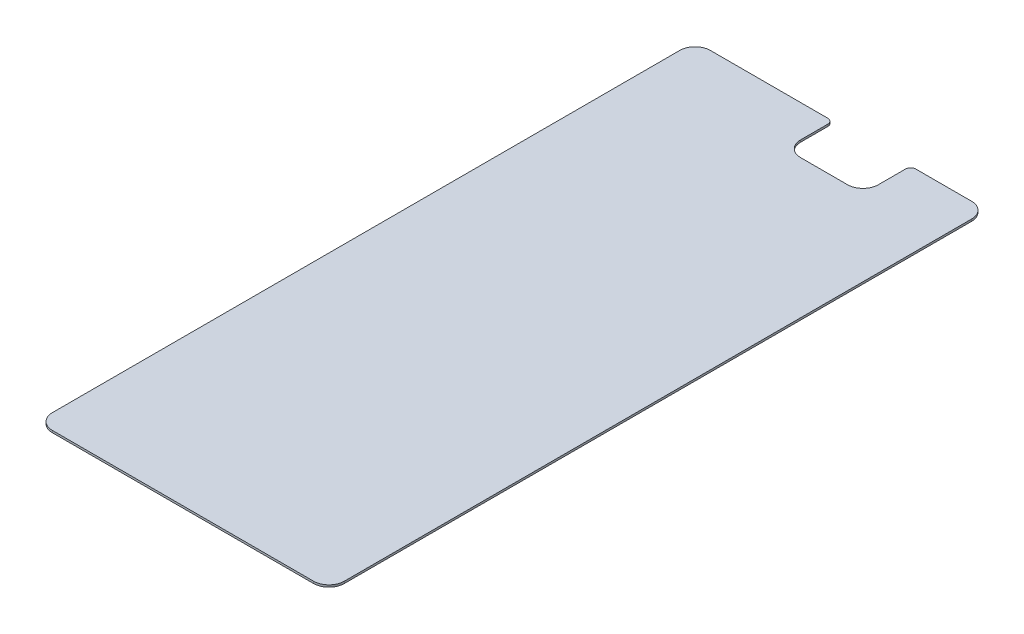
ISO-10303-21;
HEADER;
FILE_DESCRIPTION(('STEP AP214'),'2;1');
FILE_NAME('part.step','',(''),(''),'','','');
FILE_SCHEMA(('AUTOMOTIVE_DESIGN { 1 0 10303 214 1 1 1 1 }'));
ENDSEC;
DATA;
#1=APPLICATION_CONTEXT('core data for automotive mechanical design processes');
#2=APPLICATION_PROTOCOL_DEFINITION('international standard','automotive_design',2000,#1);
#3=PRODUCT_CONTEXT('',#1,'mechanical');
#4=PRODUCT('Part','Part','',(#3));
#5=PRODUCT_RELATED_PRODUCT_CATEGORY('part','',(#4));
#6=PRODUCT_DEFINITION_FORMATION('','',#4);
#7=PRODUCT_DEFINITION_CONTEXT('part definition',#1,'design');
#8=PRODUCT_DEFINITION('design','',#6,#7);
#9=PRODUCT_DEFINITION_SHAPE('','',#8);
#10=(LENGTH_UNIT() NAMED_UNIT(*) SI_UNIT(.MILLI.,.METRE.));
#11=(NAMED_UNIT(*) PLANE_ANGLE_UNIT() SI_UNIT($,.RADIAN.));
#12=(NAMED_UNIT(*) SI_UNIT($,.STERADIAN.) SOLID_ANGLE_UNIT());
#13=UNCERTAINTY_MEASURE_WITH_UNIT(LENGTH_MEASURE(1.E-05),#10,'distance_accuracy_value','');
#14=(GEOMETRIC_REPRESENTATION_CONTEXT(3) GLOBAL_UNCERTAINTY_ASSIGNED_CONTEXT((#13)) GLOBAL_UNIT_ASSIGNED_CONTEXT((#10,
#11,#12)) REPRESENTATION_CONTEXT('',''));
#15=CARTESIAN_POINT('',(0.,0.,0.));
#16=DIRECTION('',(0.,0.,1.));
#17=DIRECTION('',(1.,0.,0.));
#18=AXIS2_PLACEMENT_3D('',#15,#16,#17);
#19=CARTESIAN_POINT('',(12.7357421171239,29.2000004392877,-39.7483789044071));
#20=CARTESIAN_POINT('',(12.8347081232814,29.2000004392877,-39.7483789042746));
#21=CARTESIAN_POINT('',(12.9320248360273,29.2000004392877,-39.7386882795925));
#22=CARTESIAN_POINT('',(13.123491519264,29.2000004392877,-39.7007004499652));
#23=CARTESIAN_POINT('',(13.2186313452943,29.2000004392877,-39.6719438307547));
#24=CARTESIAN_POINT('',(13.4000890739177,29.2000004392877,-39.5968364621105));
#25=CARTESIAN_POINT('',(13.4861543632835,29.2000004392877,-39.5508677837086));
#26=CARTESIAN_POINT('',(13.649039179167,29.2000004392877,-39.4422472942158));
#27=CARTESIAN_POINT('',(13.7261743302098,29.2000004392877,-39.3790074195155));
#28=CARTESIAN_POINT('',(13.9335668916226,29.2000004392877,-39.1717648737987));
#29=CARTESIAN_POINT('',(14.0452337496107,29.2000004392877,-39.0046835879879));
#30=CARTESIAN_POINT('',(14.1948098828725,29.2000004392877,-38.6442237018757));
#31=CARTESIAN_POINT('',(14.2345237691507,29.2000004392877,-38.4475304129805));
#32=CARTESIAN_POINT('',(14.2345237691507,29.2000004392877,-38.249597250369));
#33=B_SPLINE_CURVE_WITH_KNOTS('',3,(#19,#20,#21,#22,#23,#24,#25,#26,#27,#28,#29,#30,#31,#32),
.UNSPECIFIED.,.F.,.F.,(4,2,2,2,2,2,4),(0.,0.124999999999998,0.249999999999996,0.374999999999994,
0.499999999999992,0.75,1.),.UNSPECIFIED.);
#34=DIRECTION('',(0.,1.,0.));
#35=VECTOR('',#34,1.);
#36=SURFACE_OF_LINEAR_EXTRUSION('',#33,#35);
#37=CARTESIAN_POINT('',(12.7357421171239,29.4000004392877,-39.7483789044071));
#38=CARTESIAN_POINT('',(12.8347081232814,29.4000004392877,-39.7483789042746));
#39=CARTESIAN_POINT('',(12.9320248360273,29.4000004392877,-39.7386882795925));
#40=CARTESIAN_POINT('',(13.123491519264,29.4000004392877,-39.7007004499652));
#41=CARTESIAN_POINT('',(13.2186313452943,29.4000004392877,-39.6719438307547));
#42=CARTESIAN_POINT('',(13.4000890739177,29.4000004392877,-39.5968364621105));
#43=CARTESIAN_POINT('',(13.4861543632835,29.4000004392877,-39.5508677837086));
#44=CARTESIAN_POINT('',(13.649039179167,29.4000004392877,-39.4422472942158));
#45=CARTESIAN_POINT('',(13.7261743302098,29.4000004392877,-39.3790074195155));
#46=CARTESIAN_POINT('',(13.9335668916226,29.4000004392877,-39.1717648737987));
#47=CARTESIAN_POINT('',(14.0452337496107,29.4000004392877,-39.0046835879879));
#48=CARTESIAN_POINT('',(14.1948098828725,29.4000004392877,-38.6442237018757));
#49=CARTESIAN_POINT('',(14.2345237691507,29.4000004392877,-38.4475304129805));
#50=CARTESIAN_POINT('',(14.2345237691507,29.4000004392877,-38.249597250369));
#51=B_SPLINE_CURVE_WITH_KNOTS('',3,(#37,#38,#39,#40,#41,#42,#43,#44,#45,#46,#47,#48,#49,#50),
.UNSPECIFIED.,.F.,.F.,(4,2,2,2,2,2,4),(0.,0.124999999999998,0.249999999999996,0.374999999999994,
0.499999999999992,0.75,1.),.UNSPECIFIED.);
#52=CARTESIAN_POINT('',(12.7357421171239,29.4000004392877,-39.7483789044071));
#53=VERTEX_POINT('',#52);
#54=CARTESIAN_POINT('',(14.2345237691507,29.4000004392877,-38.249597250369));
#55=VERTEX_POINT('',#54);
#56=EDGE_CURVE('E295',#53,#55,#51,.T.);
#57=ORIENTED_EDGE('',*,*,#56,.T.);
#58=DIRECTION('',(0.,1.,0.));
#59=VECTOR('',#58,1.);
#60=CARTESIAN_POINT('',(14.2345237691507,29.2000004392877,-38.249597250369));
#61=LINE('',#60,#59);
#62=CARTESIAN_POINT('',(14.2345237691507,29.2000004392877,-38.249597250369));
#63=VERTEX_POINT('',#62);
#64=EDGE_CURVE('E11',#63,#55,#61,.T.);
#65=ORIENTED_EDGE('',*,*,#64,.F.);
#66=CARTESIAN_POINT('',(14.2345237691507,29.2000004392877,-38.249597250369));
#67=CARTESIAN_POINT('',(14.2345237691507,29.2000004392877,-38.4475304129805));
#68=CARTESIAN_POINT('',(14.1948098828725,29.2000004392877,-38.6442237018757));
#69=CARTESIAN_POINT('',(14.0452337496107,29.2000004392877,-39.0046835879879));
#70=CARTESIAN_POINT('',(13.9335668916226,29.2000004392877,-39.1717648737987));
#71=CARTESIAN_POINT('',(13.7261743302098,29.2000004392877,-39.3790074195155));
#72=CARTESIAN_POINT('',(13.649039179167,29.2000004392877,-39.4422472942158));
#73=CARTESIAN_POINT('',(13.4861543632835,29.2000004392877,-39.5508677837086));
#74=CARTESIAN_POINT('',(13.4000890739177,29.2000004392877,-39.5968364621105));
#75=CARTESIAN_POINT('',(13.2186313452943,29.2000004392877,-39.6719438307547));
#76=CARTESIAN_POINT('',(13.123491519264,29.2000004392877,-39.7007004499652));
#77=CARTESIAN_POINT('',(12.9320248360273,29.2000004392877,-39.7386882795925));
#78=CARTESIAN_POINT('',(12.8347081232814,29.2000004392877,-39.7483789042746));
#79=CARTESIAN_POINT('',(12.7357421171239,29.2000004392877,-39.7483789044071));
#80=B_SPLINE_CURVE_WITH_KNOTS('',3,(#66,#67,#68,#69,#70,#71,#72,#73,#74,#75,#76,#77,#78,#79),
.UNSPECIFIED.,.F.,.F.,(4,2,2,2,2,2,4),(0.,0.25,0.500000000000008,0.625000000000006,
0.750000000000004,0.875000000000002,1.),.UNSPECIFIED.);
#81=CARTESIAN_POINT('',(12.7357421171239,29.2000004392877,-39.7483789044071));
#82=VERTEX_POINT('',#81);
#83=EDGE_CURVE('E300',#82,#63,#80,.F.);
#84=ORIENTED_EDGE('',*,*,#83,.F.);
#85=DIRECTION('',(0.,1.,0.));
#86=VECTOR('',#85,1.);
#87=CARTESIAN_POINT('',(12.7357421171239,29.2000004392877,-39.7483789044071));
#88=LINE('',#87,#86);
#89=EDGE_CURVE('E315',#82,#53,#88,.T.);
#90=ORIENTED_EDGE('',*,*,#89,.T.);
#91=EDGE_LOOP('',(#57,#65,#84,#90));
#92=FACE_BOUND('',#91,.T.);
#93=ADVANCED_FACE('F16',(#92),#36,.F.);
#94=CARTESIAN_POINT('',(14.2345237691507,29.2000004392877,-38.249597250369));
#95=DIRECTION('',(-1.,0.,0.));
#96=DIRECTION('',(0.,0.,1.));
#97=AXIS2_PLACEMENT_3D('',#94,#95,#96);
#98=PLANE('',#97);
#99=DIRECTION('',(0.,0.,1.));
#100=VECTOR('',#99,1.);
#101=CARTESIAN_POINT('',(14.2345237691507,29.4000004392877,-38.249597250369));
#102=LINE('',#101,#100);
#103=CARTESIAN_POINT('',(14.2345237691497,29.4000004392877,22.9250826991968));
#104=VERTEX_POINT('',#103);
#105=EDGE_CURVE('E287',#55,#104,#102,.T.);
#106=ORIENTED_EDGE('',*,*,#105,.T.);
#107=DIRECTION('',(0.,1.,0.));
#108=VECTOR('',#107,1.);
#109=CARTESIAN_POINT('',(14.2345237691497,29.2000004392877,22.9250826991968));
#110=LINE('',#109,#108);
#111=CARTESIAN_POINT('',(14.2345237691497,29.2000004392877,22.9250826991968));
#112=VERTEX_POINT('',#111);
#113=EDGE_CURVE('E29',#112,#104,#110,.T.);
#114=ORIENTED_EDGE('',*,*,#113,.F.);
#115=DIRECTION('',(0.,0.,1.));
#116=VECTOR('',#115,1.);
#117=CARTESIAN_POINT('',(14.2345237691507,29.2000004392877,-38.249597250369));
#118=LINE('',#117,#116);
#119=EDGE_CURVE('E106',#63,#112,#118,.T.);
#120=ORIENTED_EDGE('',*,*,#119,.F.);
#121=ORIENTED_EDGE('',*,*,#64,.T.);
#122=EDGE_LOOP('',(#106,#114,#120,#121));
#123=FACE_BOUND('',#122,.T.);
#124=ADVANCED_FACE('F338',(#123),#98,.F.);
#125=CARTESIAN_POINT('',(14.2345237691497,29.2000004392877,22.9250826991968));
#126=CARTESIAN_POINT('',(14.2345237691497,29.2000004392877,23.0240487054391));
#127=CARTESIAN_POINT('',(14.2248331445817,29.2000004392877,23.12136541828));
#128=CARTESIAN_POINT('',(14.1868453151464,29.2000004392877,23.3128321017264));
#129=CARTESIAN_POINT('',(14.158088696013,29.2000004392877,23.4079719278747));
#130=CARTESIAN_POINT('',(14.0829813274896,29.2000004392877,23.5894296567222));
#131=CARTESIAN_POINT('',(14.0370126491286,29.2000004392877,23.675494946204));
#132=CARTESIAN_POINT('',(13.9283921596748,29.2000004392877,23.8383797623249));
#133=CARTESIAN_POINT('',(13.8651522849792,29.2000004392877,23.9155149134795));
#134=CARTESIAN_POINT('',(13.6579097392322,29.2000004392877,24.1229074752012));
#135=CARTESIAN_POINT('',(13.4908284533264,29.2000004392877,24.2345743333764));
#136=CARTESIAN_POINT('',(13.1303685669569,29.2000004392877,24.3841504668876));
#137=CARTESIAN_POINT('',(12.9336752778928,29.2000004392877,24.423864353235));
#138=CARTESIAN_POINT('',(12.7357421151115,29.2000004392877,24.423864353235));
#139=B_SPLINE_CURVE_WITH_KNOTS('',3,(#125,#126,#127,#128,#129,#130,#131,#132,#133,#134,#135,
#136,#137,#138),.UNSPECIFIED.,.F.,.F.,(4,2,2,2,2,2,4),(0.,0.125,0.25,0.375,0.5,0.75,1.),.UNSPECIFIED.);
#140=DIRECTION('',(0.,1.,0.));
#141=VECTOR('',#140,1.);
#142=SURFACE_OF_LINEAR_EXTRUSION('',#139,#141);
#143=CARTESIAN_POINT('',(14.2345237691497,29.4000004392877,22.9250826991968));
#144=CARTESIAN_POINT('',(14.2345237691497,29.4000004392877,23.0240487054391));
#145=CARTESIAN_POINT('',(14.2248331445817,29.4000004392877,23.12136541828));
#146=CARTESIAN_POINT('',(14.1868453151464,29.4000004392877,23.3128321017264));
#147=CARTESIAN_POINT('',(14.158088696013,29.4000004392877,23.4079719278747));
#148=CARTESIAN_POINT('',(14.0829813274896,29.4000004392877,23.5894296567222));
#149=CARTESIAN_POINT('',(14.0370126491286,29.4000004392877,23.675494946204));
#150=CARTESIAN_POINT('',(13.9283921596748,29.4000004392877,23.8383797623249));
#151=CARTESIAN_POINT('',(13.8651522849792,29.4000004392877,23.9155149134795));
#152=CARTESIAN_POINT('',(13.6579097392322,29.4000004392877,24.1229074752012));
#153=CARTESIAN_POINT('',(13.4908284533264,29.4000004392877,24.2345743333764));
#154=CARTESIAN_POINT('',(13.1303685669569,29.4000004392877,24.3841504668876));
#155=CARTESIAN_POINT('',(12.9336752778928,29.4000004392877,24.423864353235));
#156=CARTESIAN_POINT('',(12.7357421151115,29.4000004392877,24.423864353235));
#157=B_SPLINE_CURVE_WITH_KNOTS('',3,(#143,#144,#145,#146,#147,#148,#149,#150,#151,#152,#153,
#154,#155,#156),.UNSPECIFIED.,.F.,.F.,(4,2,2,2,2,2,4),(0.,0.125,0.25,0.375,0.5,0.75,1.),.UNSPECIFIED.);
#158=CARTESIAN_POINT('',(12.7357421151115,29.4000004392877,24.423864353235));
#159=VERTEX_POINT('',#158);
#160=EDGE_CURVE('E294',#104,#159,#157,.T.);
#161=ORIENTED_EDGE('',*,*,#160,.T.);
#162=DIRECTION('',(0.,1.,0.));
#163=VECTOR('',#162,1.);
#164=CARTESIAN_POINT('',(12.7357421151115,29.2000004392877,24.423864353235));
#165=LINE('',#164,#163);
#166=CARTESIAN_POINT('',(12.7357421151115,29.2000004392877,24.423864353235));
#167=VERTEX_POINT('',#166);
#168=EDGE_CURVE('E442',#167,#159,#165,.T.);
#169=ORIENTED_EDGE('',*,*,#168,.F.);
#170=CARTESIAN_POINT('',(12.7357421151115,29.2000004392877,24.423864353235));
#171=CARTESIAN_POINT('',(12.9336752778928,29.2000004392877,24.423864353235));
#172=CARTESIAN_POINT('',(13.1303685669569,29.2000004392877,24.3841504668876));
#173=CARTESIAN_POINT('',(13.4908284533264,29.2000004392877,24.2345743333764));
#174=CARTESIAN_POINT('',(13.6579097392322,29.2000004392877,24.1229074752012));
#175=CARTESIAN_POINT('',(13.8651522849792,29.2000004392877,23.9155149134795));
#176=CARTESIAN_POINT('',(13.9283921596748,29.2000004392877,23.8383797623249));
#177=CARTESIAN_POINT('',(14.0370126491286,29.2000004392877,23.675494946204));
#178=CARTESIAN_POINT('',(14.0829813274896,29.2000004392877,23.5894296567222));
#179=CARTESIAN_POINT('',(14.158088696013,29.2000004392877,23.4079719278747));
#180=CARTESIAN_POINT('',(14.1868453151464,29.2000004392877,23.3128321017264));
#181=CARTESIAN_POINT('',(14.2248331445817,29.2000004392877,23.12136541828));
#182=CARTESIAN_POINT('',(14.2345237691497,29.2000004392877,23.0240487054391));
#183=CARTESIAN_POINT('',(14.2345237691497,29.2000004392877,22.9250826991968));
#184=B_SPLINE_CURVE_WITH_KNOTS('',3,(#170,#171,#172,#173,#174,#175,#176,#177,#178,#179,#180,
#181,#182,#183),.UNSPECIFIED.,.F.,.F.,(4,2,2,2,2,2,4),(0.,0.25,0.5,0.625,0.75,0.875,1.),.UNSPECIFIED.);
#185=EDGE_CURVE('E420',#112,#167,#184,.F.);
#186=ORIENTED_EDGE('',*,*,#185,.F.);
#187=ORIENTED_EDGE('',*,*,#113,.T.);
#188=EDGE_LOOP('',(#161,#169,#186,#187));
#189=FACE_BOUND('',#188,.T.);
#190=ADVANCED_FACE('F345',(#189),#142,.F.);
#191=CARTESIAN_POINT('',(12.7357421151115,29.2000004392877,24.423864353235));
#192=DIRECTION('',(0.,0.,-1.));
#193=DIRECTION('',(-1.,0.,0.));
#194=AXIS2_PLACEMENT_3D('',#191,#192,#193);
#195=PLANE('',#194);
#196=DIRECTION('',(-1.,0.,0.));
#197=VECTOR('',#196,1.);
#198=CARTESIAN_POINT('',(12.7357421151115,29.4000004392877,24.423864353235));
#199=LINE('',#198,#197);
#200=CARTESIAN_POINT('',(-12.7357421151143,29.4000004392877,24.423864353235));
#201=VERTEX_POINT('',#200);
#202=EDGE_CURVE('E405',#159,#201,#199,.T.);
#203=ORIENTED_EDGE('',*,*,#202,.T.);
#204=DIRECTION('',(0.,1.,0.));
#205=VECTOR('',#204,1.);
#206=CARTESIAN_POINT('',(-12.7357421151143,29.2000004392877,24.423864353235));
#207=LINE('',#206,#205);
#208=CARTESIAN_POINT('',(-12.7357421151143,29.2000004392877,24.423864353235));
#209=VERTEX_POINT('',#208);
#210=EDGE_CURVE('E446',#209,#201,#207,.T.);
#211=ORIENTED_EDGE('',*,*,#210,.F.);
#212=DIRECTION('',(-1.,0.,0.));
#213=VECTOR('',#212,1.);
#214=CARTESIAN_POINT('',(12.7357421151115,29.2000004392877,24.423864353235));
#215=LINE('',#214,#213);
#216=EDGE_CURVE('E457',#167,#209,#215,.T.);
#217=ORIENTED_EDGE('',*,*,#216,.F.);
#218=ORIENTED_EDGE('',*,*,#168,.T.);
#219=EDGE_LOOP('',(#203,#211,#217,#218));
#220=FACE_BOUND('',#219,.T.);
#221=ADVANCED_FACE('F350',(#220),#195,.F.);
#222=CARTESIAN_POINT('',(-12.7357421151143,29.2000004392877,24.423864353235));
#223=CARTESIAN_POINT('',(-12.8347081213566,29.2000004392877,24.423864353235));
#224=CARTESIAN_POINT('',(-12.9320248341975,29.2000004392877,24.4141737286669));
#225=CARTESIAN_POINT('',(-13.1234915176438,29.2000004392877,24.3761858992316));
#226=CARTESIAN_POINT('',(-13.2186313437922,29.2000004392877,24.3474292800982));
#227=CARTESIAN_POINT('',(-13.4000890726397,29.2000004392877,24.2723219115748));
#228=CARTESIAN_POINT('',(-13.4861543621214,29.2000004392877,24.2263532332138));
#229=CARTESIAN_POINT('',(-13.6490391782424,29.2000004392877,24.1177327437601));
#230=CARTESIAN_POINT('',(-13.726174329397,29.2000004392877,24.0544928690645));
#231=CARTESIAN_POINT('',(-13.9335668911186,29.2000004392877,23.8472503233174));
#232=CARTESIAN_POINT('',(-14.0452337492939,29.2000004392877,23.6801690374116));
#233=CARTESIAN_POINT('',(-14.1948098828051,29.2000004392877,23.3197091510421));
#234=CARTESIAN_POINT('',(-14.2345237691525,29.2000004392877,23.123015861978));
#235=CARTESIAN_POINT('',(-14.2345237691525,29.2000004392877,22.9250826991968));
#236=B_SPLINE_CURVE_WITH_KNOTS('',3,(#222,#223,#224,#225,#226,#227,#228,#229,#230,#231,#232,
#233,#234,#235),.UNSPECIFIED.,.F.,.F.,(4,2,2,2,2,2,4),(0.,0.125,0.25,0.375,0.5,0.75,1.),.UNSPECIFIED.);
#237=DIRECTION('',(0.,1.,0.));
#238=VECTOR('',#237,1.);
#239=SURFACE_OF_LINEAR_EXTRUSION('',#236,#238);
#240=CARTESIAN_POINT('',(-12.7357421151143,29.4000004392877,24.423864353235));
#241=CARTESIAN_POINT('',(-12.8347081213566,29.4000004392877,24.423864353235));
#242=CARTESIAN_POINT('',(-12.9320248341975,29.4000004392877,24.4141737286669));
#243=CARTESIAN_POINT('',(-13.1234915176438,29.4000004392877,24.3761858992316));
#244=CARTESIAN_POINT('',(-13.2186313437922,29.4000004392877,24.3474292800982));
#245=CARTESIAN_POINT('',(-13.4000890726397,29.4000004392877,24.2723219115748));
#246=CARTESIAN_POINT('',(-13.4861543621214,29.4000004392877,24.2263532332138));
#247=CARTESIAN_POINT('',(-13.6490391782424,29.4000004392877,24.1177327437601));
#248=CARTESIAN_POINT('',(-13.726174329397,29.4000004392877,24.0544928690645));
#249=CARTESIAN_POINT('',(-13.9335668911186,29.4000004392877,23.8472503233174));
#250=CARTESIAN_POINT('',(-14.0452337492939,29.4000004392877,23.6801690374116));
#251=CARTESIAN_POINT('',(-14.1948098828051,29.4000004392877,23.3197091510421));
#252=CARTESIAN_POINT('',(-14.2345237691525,29.4000004392877,23.123015861978));
#253=CARTESIAN_POINT('',(-14.2345237691525,29.4000004392877,22.9250826991968));
#254=B_SPLINE_CURVE_WITH_KNOTS('',3,(#240,#241,#242,#243,#244,#245,#246,#247,#248,#249,#250,
#251,#252,#253),.UNSPECIFIED.,.F.,.F.,(4,2,2,2,2,2,4),(0.,0.125,0.25,0.375,0.5,0.75,1.),.UNSPECIFIED.);
#255=CARTESIAN_POINT('',(-14.2345237691525,29.4000004392877,22.9250826991968));
#256=VERTEX_POINT('',#255);
#257=EDGE_CURVE('E404',#201,#256,#254,.T.);
#258=ORIENTED_EDGE('',*,*,#257,.T.);
#259=DIRECTION('',(0.,1.,0.));
#260=VECTOR('',#259,1.);
#261=CARTESIAN_POINT('',(-14.2345237691525,29.2000004392877,22.9250826991968));
#262=LINE('',#261,#260);
#263=CARTESIAN_POINT('',(-14.2345237691525,29.2000004392877,22.9250826991968));
#264=VERTEX_POINT('',#263);
#265=EDGE_CURVE('E465',#264,#256,#262,.T.);
#266=ORIENTED_EDGE('',*,*,#265,.F.);
#267=CARTESIAN_POINT('',(-14.2345237691525,29.2000004392877,22.9250826991968));
#268=CARTESIAN_POINT('',(-14.2345237691525,29.2000004392877,23.123015861978));
#269=CARTESIAN_POINT('',(-14.1948098828051,29.2000004392877,23.3197091510421));
#270=CARTESIAN_POINT('',(-14.0452337492939,29.2000004392877,23.6801690374116));
#271=CARTESIAN_POINT('',(-13.9335668911186,29.2000004392877,23.8472503233174));
#272=CARTESIAN_POINT('',(-13.726174329397,29.2000004392877,24.0544928690645));
#273=CARTESIAN_POINT('',(-13.6490391782424,29.2000004392877,24.1177327437601));
#274=CARTESIAN_POINT('',(-13.4861543621214,29.2000004392877,24.2263532332138));
#275=CARTESIAN_POINT('',(-13.4000890726397,29.2000004392877,24.2723219115748));
#276=CARTESIAN_POINT('',(-13.2186313437922,29.2000004392877,24.3474292800982));
#277=CARTESIAN_POINT('',(-13.1234915176438,29.2000004392877,24.3761858992316));
#278=CARTESIAN_POINT('',(-12.9320248341975,29.2000004392877,24.4141737286669));
#279=CARTESIAN_POINT('',(-12.8347081213566,29.2000004392877,24.423864353235));
#280=CARTESIAN_POINT('',(-12.7357421151143,29.2000004392877,24.423864353235));
#281=B_SPLINE_CURVE_WITH_KNOTS('',3,(#267,#268,#269,#270,#271,#272,#273,#274,#275,#276,#277,
#278,#279,#280),.UNSPECIFIED.,.F.,.F.,(4,2,2,2,2,2,4),(0.,0.25,0.5,0.625,0.75,0.875,1.),.UNSPECIFIED.);
#282=EDGE_CURVE('E459',#209,#264,#281,.F.);
#283=ORIENTED_EDGE('',*,*,#282,.F.);
#284=ORIENTED_EDGE('',*,*,#210,.T.);
#285=EDGE_LOOP('',(#258,#266,#283,#284));
#286=FACE_BOUND('',#285,.T.);
#287=ADVANCED_FACE('F379',(#286),#239,.F.);
#288=CARTESIAN_POINT('',(-14.2345237691525,29.2000004392877,22.9250826991968));
#289=DIRECTION('',(1.,0.,0.));
#290=DIRECTION('',(0.,0.,-1.));
#291=AXIS2_PLACEMENT_3D('',#288,#289,#290);
#292=PLANE('',#291);
#293=DIRECTION('',(0.,0.,-1.));
#294=VECTOR('',#293,1.);
#295=CARTESIAN_POINT('',(-14.2345237691525,29.4000004392877,22.9250826991968));
#296=LINE('',#295,#294);
#297=CARTESIAN_POINT('',(-14.2345237691507,29.4000004392877,-38.2495972503689));
#298=VERTEX_POINT('',#297);
#299=EDGE_CURVE('E407',#256,#298,#296,.T.);
#300=ORIENTED_EDGE('',*,*,#299,.T.);
#301=DIRECTION('',(0.,1.,0.));
#302=VECTOR('',#301,1.);
#303=CARTESIAN_POINT('',(-14.2345237691507,29.2000004392877,-38.2495972503689));
#304=LINE('',#303,#302);
#305=CARTESIAN_POINT('',(-14.2345237691507,29.2000004392877,-38.2495972503689));
#306=VERTEX_POINT('',#305);
#307=EDGE_CURVE('E468',#306,#298,#304,.T.);
#308=ORIENTED_EDGE('',*,*,#307,.F.);
#309=DIRECTION('',(0.,0.,-1.));
#310=VECTOR('',#309,1.);
#311=CARTESIAN_POINT('',(-14.2345237691525,29.2000004392877,22.9250826991968));
#312=LINE('',#311,#310);
#313=EDGE_CURVE('E460',#264,#306,#312,.T.);
#314=ORIENTED_EDGE('',*,*,#313,.F.);
#315=ORIENTED_EDGE('',*,*,#265,.T.);
#316=EDGE_LOOP('',(#300,#308,#314,#315));
#317=FACE_BOUND('',#316,.T.);
#318=ADVANCED_FACE('F383',(#317),#292,.F.);
#319=CARTESIAN_POINT('',(-14.2345237691507,29.2000004392877,-38.2495972503689));
#320=CARTESIAN_POINT('',(-14.2345237691507,29.2000004392877,-38.3485632566111));
#321=CARTESIAN_POINT('',(-14.2248331445845,29.2000004392877,-38.4458799694522));
#322=CARTESIAN_POINT('',(-14.1868453151492,29.2000004392877,-38.6373466528985));
#323=CARTESIAN_POINT('',(-14.1580886960158,29.2000004392877,-38.7324864790469));
#324=CARTESIAN_POINT('',(-14.0829813274924,29.2000004392877,-38.9139442078944));
#325=CARTESIAN_POINT('',(-14.0370126491314,29.2000004392877,-39.0000094973761));
#326=CARTESIAN_POINT('',(-13.9283921596776,29.2000004392877,-39.1628943134971));
#327=CARTESIAN_POINT('',(-13.865152284982,29.2000004392877,-39.2400294646517));
#328=CARTESIAN_POINT('',(-13.657909739235,29.2000004392877,-39.4474220263734));
#329=CARTESIAN_POINT('',(-13.4908284533292,29.2000004392877,-39.5590888845487));
#330=CARTESIAN_POINT('',(-13.1303685669597,29.2000004392877,-39.7086650180599));
#331=CARTESIAN_POINT('',(-12.9336752778956,29.2000004392877,-39.7483789044073));
#332=CARTESIAN_POINT('',(-12.7357421151143,29.2000004392877,-39.7483789044073));
#333=B_SPLINE_CURVE_WITH_KNOTS('',3,(#319,#320,#321,#322,#323,#324,#325,#326,#327,#328,#329,
#330,#331,#332),.UNSPECIFIED.,.F.,.F.,(4,2,2,2,2,2,4),(0.,0.125000000000001,0.25,0.375,0.5,0.75,
1.),.UNSPECIFIED.);
#334=DIRECTION('',(0.,1.,0.));
#335=VECTOR('',#334,1.);
#336=SURFACE_OF_LINEAR_EXTRUSION('',#333,#335);
#337=CARTESIAN_POINT('',(-14.2345237691507,29.4000004392877,-38.2495972503689));
#338=CARTESIAN_POINT('',(-14.2345237691507,29.4000004392877,-38.3485632566111));
#339=CARTESIAN_POINT('',(-14.2248331445845,29.4000004392877,-38.4458799694522));
#340=CARTESIAN_POINT('',(-14.1868453151492,29.4000004392877,-38.6373466528985));
#341=CARTESIAN_POINT('',(-14.1580886960158,29.4000004392877,-38.7324864790469));
#342=CARTESIAN_POINT('',(-14.0829813274924,29.4000004392877,-38.9139442078944));
#343=CARTESIAN_POINT('',(-14.0370126491314,29.4000004392877,-39.0000094973761));
#344=CARTESIAN_POINT('',(-13.9283921596776,29.4000004392877,-39.1628943134971));
#345=CARTESIAN_POINT('',(-13.865152284982,29.4000004392877,-39.2400294646517));
#346=CARTESIAN_POINT('',(-13.657909739235,29.4000004392877,-39.4474220263734));
#347=CARTESIAN_POINT('',(-13.4908284533292,29.4000004392877,-39.5590888845487));
#348=CARTESIAN_POINT('',(-13.1303685669597,29.4000004392877,-39.7086650180599));
#349=CARTESIAN_POINT('',(-12.9336752778956,29.4000004392877,-39.7483789044073));
#350=CARTESIAN_POINT('',(-12.7357421151143,29.4000004392877,-39.7483789044073));
#351=B_SPLINE_CURVE_WITH_KNOTS('',3,(#337,#338,#339,#340,#341,#342,#343,#344,#345,#346,#347,
#348,#349,#350),.UNSPECIFIED.,.F.,.F.,(4,2,2,2,2,2,4),(0.,0.125000000000001,0.25,0.375,0.5,0.75,
1.),.UNSPECIFIED.);
#352=CARTESIAN_POINT('',(-12.7357421151143,29.4000004392877,-39.7483789044073));
#353=VERTEX_POINT('',#352);
#354=EDGE_CURVE('E411',#298,#353,#351,.T.);
#355=ORIENTED_EDGE('',*,*,#354,.T.);
#356=DIRECTION('',(0.,1.,0.));
#357=VECTOR('',#356,1.);
#358=CARTESIAN_POINT('',(-12.7357421151143,29.2000004392877,-39.7483789044073));
#359=LINE('',#358,#357);
#360=CARTESIAN_POINT('',(-12.7357421151143,29.2000004392877,-39.7483789044073));
#361=VERTEX_POINT('',#360);
#362=EDGE_CURVE('E473',#361,#353,#359,.T.);
#363=ORIENTED_EDGE('',*,*,#362,.F.);
#364=CARTESIAN_POINT('',(-12.7357421151143,29.2000004392877,-39.7483789044073));
#365=CARTESIAN_POINT('',(-12.9336752778956,29.2000004392877,-39.7483789044073));
#366=CARTESIAN_POINT('',(-13.1303685669597,29.2000004392877,-39.7086650180599));
#367=CARTESIAN_POINT('',(-13.4908284533292,29.2000004392877,-39.5590888845487));
#368=CARTESIAN_POINT('',(-13.657909739235,29.2000004392877,-39.4474220263734));
#369=CARTESIAN_POINT('',(-13.865152284982,29.2000004392877,-39.2400294646517));
#370=CARTESIAN_POINT('',(-13.9283921596776,29.2000004392877,-39.1628943134971));
#371=CARTESIAN_POINT('',(-14.0370126491314,29.2000004392877,-39.0000094973761));
#372=CARTESIAN_POINT('',(-14.0829813274924,29.2000004392877,-38.9139442078944));
#373=CARTESIAN_POINT('',(-14.1580886960158,29.2000004392877,-38.7324864790469));
#374=CARTESIAN_POINT('',(-14.1868453151492,29.2000004392877,-38.6373466528985));
#375=CARTESIAN_POINT('',(-14.2248331445845,29.2000004392877,-38.4458799694522));
#376=CARTESIAN_POINT('',(-14.2345237691507,29.2000004392877,-38.3485632566111));
#377=CARTESIAN_POINT('',(-14.2345237691507,29.2000004392877,-38.2495972503689));
#378=B_SPLINE_CURVE_WITH_KNOTS('',3,(#364,#365,#366,#367,#368,#369,#370,#371,#372,#373,#374,
#375,#376,#377),.UNSPECIFIED.,.F.,.F.,(4,2,2,2,2,2,4),(0.,0.25,0.5,0.625,0.75,0.874999999999999,
1.),.UNSPECIFIED.);
#379=EDGE_CURVE('E515',#306,#361,#378,.F.);
#380=ORIENTED_EDGE('',*,*,#379,.F.);
#381=ORIENTED_EDGE('',*,*,#307,.T.);
#382=EDGE_LOOP('',(#355,#363,#380,#381));
#383=FACE_BOUND('',#382,.T.);
#384=ADVANCED_FACE('F493',(#383),#336,.F.);
#385=CARTESIAN_POINT('',(-12.7357421151143,29.2000004392877,-39.7483789044073));
#386=DIRECTION('',(0.,0.,1.));
#387=DIRECTION('',(1.,0.,0.));
#388=AXIS2_PLACEMENT_3D('',#385,#386,#387);
#389=PLANE('',#388);
#390=DIRECTION('',(1.,0.,0.));
#391=VECTOR('',#390,1.);
#392=CARTESIAN_POINT('',(-12.7357421151143,29.4000004392877,-39.7483789044073));
#393=LINE('',#392,#391);
#394=CARTESIAN_POINT('',(-1.29135203073102,29.4000004392877,-39.7483789044073));
#395=VERTEX_POINT('',#394);
#396=EDGE_CURVE('E594',#353,#395,#393,.T.);
#397=ORIENTED_EDGE('',*,*,#396,.T.);
#398=DIRECTION('',(0.,1.,0.));
#399=VECTOR('',#398,1.);
#400=CARTESIAN_POINT('',(-1.29135203073102,29.2000004392877,-39.7483789044073));
#401=LINE('',#400,#399);
#402=CARTESIAN_POINT('',(-1.29135203073102,29.2000004392877,-39.7483789044073));
#403=VERTEX_POINT('',#402);
#404=EDGE_CURVE('E479',#403,#395,#401,.T.);
#405=ORIENTED_EDGE('',*,*,#404,.F.);
#406=DIRECTION('',(1.,0.,0.));
#407=VECTOR('',#406,1.);
#408=CARTESIAN_POINT('',(-12.7357421151143,29.2000004392877,-39.7483789044073));
#409=LINE('',#408,#407);
#410=EDGE_CURVE('E516',#361,#403,#409,.T.);
#411=ORIENTED_EDGE('',*,*,#410,.F.);
#412=ORIENTED_EDGE('',*,*,#362,.T.);
#413=EDGE_LOOP('',(#397,#405,#411,#412));
#414=FACE_BOUND('',#413,.T.);
#415=ADVANCED_FACE('F502',(#414),#389,.F.);
#416=CARTESIAN_POINT('',(-1.29135203073102,29.2000004392877,-39.7483789044073));
#417=CARTESIAN_POINT('',(-1.15877163460276,29.2000004392877,-39.7483789043415));
#418=CARTESIAN_POINT('',(-1.02915819802651,29.2000004392877,-39.6938687875896));
#419=CARTESIAN_POINT('',(-0.844122350767227,29.2000004392877,-39.5088973958668));
#420=CARTESIAN_POINT('',(-0.789523769185512,29.2000004392877,-39.3790475447817));
#421=CARTESIAN_POINT('',(-0.789523769152472,29.2000004392877,-39.2465506427041));
#422=B_SPLINE_CURVE_WITH_KNOTS('',3,(#416,#417,#418,#419,#420,#421),.UNSPECIFIED.,.F.,.F.,(4,2,
4),(0.,0.5,1.),.UNSPECIFIED.);
#423=DIRECTION('',(0.,1.,0.));
#424=VECTOR('',#423,1.);
#425=SURFACE_OF_LINEAR_EXTRUSION('',#422,#424);
#426=CARTESIAN_POINT('',(-1.29135203073102,29.4000004392877,-39.7483789044073));
#427=CARTESIAN_POINT('',(-1.15877163460276,29.4000004392877,-39.7483789043415));
#428=CARTESIAN_POINT('',(-1.02915819802651,29.4000004392877,-39.6938687875896));
#429=CARTESIAN_POINT('',(-0.844122350767227,29.4000004392877,-39.5088973958668));
#430=CARTESIAN_POINT('',(-0.789523769185512,29.4000004392877,-39.3790475447817));
#431=CARTESIAN_POINT('',(-0.789523769152472,29.4000004392877,-39.2465506427041));
#432=B_SPLINE_CURVE_WITH_KNOTS('',3,(#426,#427,#428,#429,#430,#431),.UNSPECIFIED.,.F.,.F.,(4,2,
4),(0.,0.5,1.),.UNSPECIFIED.);
#433=CARTESIAN_POINT('',(-0.789523769152472,29.4000004392877,-39.2465506427041));
#434=VERTEX_POINT('',#433);
#435=EDGE_CURVE('E544',#395,#434,#432,.T.);
#436=ORIENTED_EDGE('',*,*,#435,.T.);
#437=DIRECTION('',(0.,1.,0.));
#438=VECTOR('',#437,1.);
#439=CARTESIAN_POINT('',(-0.789523769152472,29.2000004392877,-39.2465506427041));
#440=LINE('',#439,#438);
#441=CARTESIAN_POINT('',(-0.789523769152472,29.2000004392877,-39.2465506427041));
#442=VERTEX_POINT('',#441);
#443=EDGE_CURVE('E532',#442,#434,#440,.T.);
#444=ORIENTED_EDGE('',*,*,#443,.F.);
#445=CARTESIAN_POINT('',(-0.789523769152472,29.2000004392877,-39.2465506427041));
#446=CARTESIAN_POINT('',(-0.789523769185512,29.2000004392877,-39.3790475447817));
#447=CARTESIAN_POINT('',(-0.844122350767227,29.2000004392877,-39.5088973958668));
#448=CARTESIAN_POINT('',(-1.02915819802651,29.2000004392877,-39.6938687875896));
#449=CARTESIAN_POINT('',(-1.15877163460276,29.2000004392877,-39.7483789043415));
#450=CARTESIAN_POINT('',(-1.29135203073102,29.2000004392877,-39.7483789044073));
#451=B_SPLINE_CURVE_WITH_KNOTS('',3,(#445,#446,#447,#448,#449,#450),.UNSPECIFIED.,.F.,.F.,(4,2,
4),(0.,0.5,1.),.UNSPECIFIED.);
#452=EDGE_CURVE('E518',#403,#442,#451,.F.);
#453=ORIENTED_EDGE('',*,*,#452,.F.);
#454=ORIENTED_EDGE('',*,*,#404,.T.);
#455=EDGE_LOOP('',(#436,#444,#453,#454));
#456=FACE_BOUND('',#455,.T.);
#457=ADVANCED_FACE('F547',(#456),#425,.F.);
#458=CARTESIAN_POINT('',(-0.789523769152472,29.2000004392877,-39.2465506427041));
#459=DIRECTION('',(-1.,0.,0.));
#460=DIRECTION('',(0.,0.,1.));
#461=AXIS2_PLACEMENT_3D('',#458,#459,#460);
#462=PLANE('',#461);
#463=DIRECTION('',(0.,0.,1.));
#464=VECTOR('',#463,1.);
#465=CARTESIAN_POINT('',(-0.789523769152472,29.4000004392877,-39.2465506427041));
#466=LINE('',#465,#464);
#467=CARTESIAN_POINT('',(-0.789523769152475,29.4000004392877,-36.5944654131895));
#468=VERTEX_POINT('',#467);
#469=EDGE_CURVE('E589',#434,#468,#466,.T.);
#470=ORIENTED_EDGE('',*,*,#469,.T.);
#471=DIRECTION('',(0.,1.,0.));
#472=VECTOR('',#471,1.);
#473=CARTESIAN_POINT('',(-0.789523769152475,29.2000004392877,-36.5944654131895));
#474=LINE('',#473,#472);
#475=CARTESIAN_POINT('',(-0.789523769152475,29.2000004392877,-36.5944654131895));
#476=VERTEX_POINT('',#475);
#477=EDGE_CURVE('E537',#476,#468,#474,.T.);
#478=ORIENTED_EDGE('',*,*,#477,.F.);
#479=DIRECTION('',(0.,0.,1.));
#480=VECTOR('',#479,1.);
#481=CARTESIAN_POINT('',(-0.789523769152472,29.2000004392877,-39.2465506427041));
#482=LINE('',#481,#480);
#483=EDGE_CURVE('E522',#442,#476,#482,.T.);
#484=ORIENTED_EDGE('',*,*,#483,.F.);
#485=ORIENTED_EDGE('',*,*,#443,.T.);
#486=EDGE_LOOP('',(#470,#478,#484,#485));
#487=FACE_BOUND('',#486,.T.);
#488=ADVANCED_FACE('F556',(#487),#462,.F.);
#489=CARTESIAN_POINT('',(-0.789523769152475,29.2000004392877,-36.5944654131895));
#490=CARTESIAN_POINT('',(-0.789523769127752,29.2000004392877,-36.4954482725938));
#491=CARTESIAN_POINT('',(-0.779760546057411,29.2000004392877,-36.3980927459573));
#492=CARTESIAN_POINT('',(-0.741726820090258,29.2000004392877,-36.2065314675444));
#493=CARTESIAN_POINT('',(-0.712993833821872,29.2000004392877,-36.1113288729297));
#494=CARTESIAN_POINT('',(-0.637825373098992,29.2000004392877,-35.9298164736012));
#495=CARTESIAN_POINT('',(-0.591769693187441,29.2000004392877,-35.8437530237763));
#496=CARTESIAN_POINT('',(-0.483076211389648,29.2000004392877,-35.6808117717267));
#497=CARTESIAN_POINT('',(-0.419854772011985,29.2000004392877,-35.6036224885568));
#498=CARTESIAN_POINT('',(-0.212547258965869,29.2000004392877,-35.3961902168796));
#499=CARTESIAN_POINT('',(-0.0454092185753658,29.2000004392877,-35.2844764978188));
#500=CARTESIAN_POINT('',(0.315119650795351,29.2000004392877,-35.1348289658925));
#501=CARTESIAN_POINT('',(0.511873940311016,29.2000004392877,-35.0950745862191));
#502=CARTESIAN_POINT('',(0.709867057743456,29.2000004392877,-35.0950745861704));
#503=B_SPLINE_CURVE_WITH_KNOTS('',3,(#489,#490,#491,#492,#493,#494,#495,#496,#497,#498,#499,
#500,#501,#502),.UNSPECIFIED.,.F.,.F.,(4,2,2,2,2,2,4),(0.,0.125,0.25,0.375,0.5,0.75,1.),.UNSPECIFIED.);
#504=DIRECTION('',(0.,1.,0.));
#505=VECTOR('',#504,1.);
#506=SURFACE_OF_LINEAR_EXTRUSION('',#503,#505);
#507=CARTESIAN_POINT('',(-0.789523769152475,29.4000004392877,-36.5944654131895));
#508=CARTESIAN_POINT('',(-0.789523769127752,29.4000004392877,-36.4954482725938));
#509=CARTESIAN_POINT('',(-0.779760546057411,29.4000004392877,-36.3980927459573));
#510=CARTESIAN_POINT('',(-0.741726820090258,29.4000004392877,-36.2065314675444));
#511=CARTESIAN_POINT('',(-0.712993833821872,29.4000004392877,-36.1113288729297));
#512=CARTESIAN_POINT('',(-0.637825373098992,29.4000004392877,-35.9298164736012));
#513=CARTESIAN_POINT('',(-0.591769693187441,29.4000004392877,-35.8437530237763));
#514=CARTESIAN_POINT('',(-0.483076211389648,29.4000004392877,-35.6808117717267));
#515=CARTESIAN_POINT('',(-0.419854772011985,29.4000004392877,-35.6036224885568));
#516=CARTESIAN_POINT('',(-0.212547258965869,29.4000004392877,-35.3961902168796));
#517=CARTESIAN_POINT('',(-0.0454092185753658,29.4000004392877,-35.2844764978188));
#518=CARTESIAN_POINT('',(0.315119650795351,29.4000004392877,-35.1348289658925));
#519=CARTESIAN_POINT('',(0.511873940311016,29.4000004392877,-35.0950745862191));
#520=CARTESIAN_POINT('',(0.709867057743456,29.4000004392877,-35.0950745861704));
#521=B_SPLINE_CURVE_WITH_KNOTS('',3,(#507,#508,#509,#510,#511,#512,#513,#514,#515,#516,#517,
#518,#519,#520),.UNSPECIFIED.,.F.,.F.,(4,2,2,2,2,2,4),(0.,0.125,0.25,0.375,0.5,0.75,1.),.UNSPECIFIED.);
#522=CARTESIAN_POINT('',(0.709867057743456,29.4000004392877,-35.0950745861704));
#523=VERTEX_POINT('',#522);
#524=EDGE_CURVE('E588',#468,#523,#521,.T.);
#525=ORIENTED_EDGE('',*,*,#524,.T.);
#526=DIRECTION('',(0.,1.,0.));
#527=VECTOR('',#526,1.);
#528=CARTESIAN_POINT('',(0.709867057743456,29.2000004392877,-35.0950745861704));
#529=LINE('',#528,#527);
#530=CARTESIAN_POINT('',(0.709867057743456,29.2000004392877,-35.0950745861704));
#531=VERTEX_POINT('',#530);
#532=EDGE_CURVE('E615',#531,#523,#529,.T.);
#533=ORIENTED_EDGE('',*,*,#532,.F.);
#534=CARTESIAN_POINT('',(0.709867057743456,29.2000004392877,-35.0950745861704));
#535=CARTESIAN_POINT('',(0.511873940311016,29.2000004392877,-35.0950745862191));
#536=CARTESIAN_POINT('',(0.315119650795351,29.2000004392877,-35.1348289658925));
#537=CARTESIAN_POINT('',(-0.0454092185753658,29.2000004392877,-35.2844764978188));
#538=CARTESIAN_POINT('',(-0.212547258965869,29.2000004392877,-35.3961902168796));
#539=CARTESIAN_POINT('',(-0.419854772011985,29.2000004392877,-35.6036224885568));
#540=CARTESIAN_POINT('',(-0.483076211389648,29.2000004392877,-35.6808117717267));
#541=CARTESIAN_POINT('',(-0.591769693187441,29.2000004392877,-35.8437530237763));
#542=CARTESIAN_POINT('',(-0.637825373098992,29.2000004392877,-35.9298164736012));
#543=CARTESIAN_POINT('',(-0.712993833821872,29.2000004392877,-36.1113288729297));
#544=CARTESIAN_POINT('',(-0.741726820090258,29.2000004392877,-36.2065314675444));
#545=CARTESIAN_POINT('',(-0.779760546057411,29.2000004392877,-36.3980927459573));
#546=CARTESIAN_POINT('',(-0.789523769127752,29.2000004392877,-36.4954482725938));
#547=CARTESIAN_POINT('',(-0.789523769152475,29.2000004392877,-36.5944654131895));
#548=B_SPLINE_CURVE_WITH_KNOTS('',3,(#534,#535,#536,#537,#538,#539,#540,#541,#542,#543,#544,
#545,#546,#547),.UNSPECIFIED.,.F.,.F.,(4,2,2,2,2,2,4),(0.,0.25,0.5,0.625,0.75,0.875,1.),.UNSPECIFIED.);
#549=EDGE_CURVE('E609',#476,#531,#548,.F.);
#550=ORIENTED_EDGE('',*,*,#549,.F.);
#551=ORIENTED_EDGE('',*,*,#477,.T.);
#552=EDGE_LOOP('',(#525,#533,#550,#551));
#553=FACE_BOUND('',#552,.T.);
#554=ADVANCED_FACE('F565',(#553),#506,.F.);
#555=CARTESIAN_POINT('',(0.709867057743456,29.2000004392877,-35.0950745861704));
#556=DIRECTION('',(0.,0.,1.));
#557=DIRECTION('',(1.,0.,0.));
#558=AXIS2_PLACEMENT_3D('',#555,#556,#557);
#559=PLANE('',#558);
#560=DIRECTION('',(1.,0.,0.));
#561=VECTOR('',#560,1.);
#562=CARTESIAN_POINT('',(0.709867057743456,29.4000004392877,-35.0950745861704));
#563=LINE('',#562,#561);
#564=CARTESIAN_POINT('',(5.29013294213338,29.4000004392877,-35.0950745861704));
#565=VERTEX_POINT('',#564);
#566=EDGE_CURVE('E237',#523,#565,#563,.T.);
#567=ORIENTED_EDGE('',*,*,#566,.T.);
#568=DIRECTION('',(0.,1.,0.));
#569=VECTOR('',#568,1.);
#570=CARTESIAN_POINT('',(5.29013294213338,29.2000004392877,-35.0950745861704));
#571=LINE('',#570,#569);
#572=CARTESIAN_POINT('',(5.29013294213338,29.2000004392877,-35.0950745861704));
#573=VERTEX_POINT('',#572);
#574=EDGE_CURVE('E618',#573,#565,#571,.T.);
#575=ORIENTED_EDGE('',*,*,#574,.F.);
#576=DIRECTION('',(1.,0.,0.));
#577=VECTOR('',#576,1.);
#578=CARTESIAN_POINT('',(0.709867057743456,29.2000004392877,-35.0950745861704));
#579=LINE('',#578,#577);
#580=EDGE_CURVE('E610',#531,#573,#579,.T.);
#581=ORIENTED_EDGE('',*,*,#580,.F.);
#582=ORIENTED_EDGE('',*,*,#532,.T.);
#583=EDGE_LOOP('',(#567,#575,#581,#582));
#584=FACE_BOUND('',#583,.T.);
#585=ADVANCED_FACE('F209',(#584),#559,.F.);
#586=CARTESIAN_POINT('',(5.29013294213338,29.2000004392877,-35.0950745861704));
#587=CARTESIAN_POINT('',(5.389150082729,29.2000004392877,-35.0950745861948));
#588=CARTESIAN_POINT('',(5.4865056093655,29.2000004392877,-35.1048378092651));
#589=CARTESIAN_POINT('',(5.67806688777828,29.2000004392877,-35.1428715352324));
#590=CARTESIAN_POINT('',(5.7732694823929,29.2000004392877,-35.1716045215009));
#591=CARTESIAN_POINT('',(5.95478188172128,29.2000004392877,-35.2467729822237));
#592=CARTESIAN_POINT('',(6.04084533154627,29.2000004392877,-35.2928286621351));
#593=CARTESIAN_POINT('',(6.20378658359586,29.2000004392877,-35.4015221439328));
#594=CARTESIAN_POINT('',(6.28097586676581,29.2000004392877,-35.4647435833105));
#595=CARTESIAN_POINT('',(6.48840813844268,29.2000004392877,-35.6720510963566));
#596=CARTESIAN_POINT('',(6.60012185750343,29.2000004392877,-35.839189136747));
#597=CARTESIAN_POINT('',(6.74976938943032,29.2000004392877,-36.1997180061171));
#598=CARTESIAN_POINT('',(6.78952376910328,29.2000004392877,-36.3964722956328));
#599=CARTESIAN_POINT('',(6.78952376915248,29.2000004392877,-36.5944654130653));
#600=B_SPLINE_CURVE_WITH_KNOTS('',3,(#586,#587,#588,#589,#590,#591,#592,#593,#594,#595,#596,
#597,#598,#599),.UNSPECIFIED.,.F.,.F.,(4,2,2,2,2,2,4),(0.,0.124999999999998,0.249999999999997,
0.374999999999994,0.499999999999993,0.75,1.),.UNSPECIFIED.);
#601=DIRECTION('',(0.,1.,0.));
#602=VECTOR('',#601,1.);
#603=SURFACE_OF_LINEAR_EXTRUSION('',#600,#602);
#604=CARTESIAN_POINT('',(5.29013294213338,29.4000004392877,-35.0950745861704));
#605=CARTESIAN_POINT('',(5.389150082729,29.4000004392877,-35.0950745861948));
#606=CARTESIAN_POINT('',(5.4865056093655,29.4000004392877,-35.1048378092651));
#607=CARTESIAN_POINT('',(5.67806688777828,29.4000004392877,-35.1428715352324));
#608=CARTESIAN_POINT('',(5.7732694823929,29.4000004392877,-35.1716045215009));
#609=CARTESIAN_POINT('',(5.95478188172128,29.4000004392877,-35.2467729822237));
#610=CARTESIAN_POINT('',(6.04084533154627,29.4000004392877,-35.2928286621351));
#611=CARTESIAN_POINT('',(6.20378658359586,29.4000004392877,-35.4015221439328));
#612=CARTESIAN_POINT('',(6.28097586676581,29.4000004392877,-35.4647435833105));
#613=CARTESIAN_POINT('',(6.48840813844268,29.4000004392877,-35.6720510963566));
#614=CARTESIAN_POINT('',(6.60012185750343,29.4000004392877,-35.839189136747));
#615=CARTESIAN_POINT('',(6.74976938943032,29.4000004392877,-36.1997180061171));
#616=CARTESIAN_POINT('',(6.78952376910328,29.4000004392877,-36.3964722956328));
#617=CARTESIAN_POINT('',(6.78952376915248,29.4000004392877,-36.5944654130653));
#618=B_SPLINE_CURVE_WITH_KNOTS('',3,(#604,#605,#606,#607,#608,#609,#610,#611,#612,#613,#614,
#615,#616,#617),.UNSPECIFIED.,.F.,.F.,(4,2,2,2,2,2,4),(0.,0.124999999999998,0.249999999999997,
0.374999999999994,0.499999999999993,0.75,1.),.UNSPECIFIED.);
#619=CARTESIAN_POINT('',(6.78952376915248,29.4000004392877,-36.5944654130653));
#620=VERTEX_POINT('',#619);
#621=EDGE_CURVE('E233',#565,#620,#618,.T.);
#622=ORIENTED_EDGE('',*,*,#621,.T.);
#623=DIRECTION('',(0.,1.,0.));
#624=VECTOR('',#623,1.);
#625=CARTESIAN_POINT('',(6.78952376915248,29.2000004392877,-36.5944654130653));
#626=LINE('',#625,#624);
#627=CARTESIAN_POINT('',(6.78952376915248,29.2000004392877,-36.5944654130653));
#628=VERTEX_POINT('',#627);
#629=EDGE_CURVE('E160',#628,#620,#626,.T.);
#630=ORIENTED_EDGE('',*,*,#629,.F.);
#631=CARTESIAN_POINT('',(6.78952376915248,29.2000004392877,-36.5944654130653));
#632=CARTESIAN_POINT('',(6.78952376910328,29.2000004392877,-36.3964722956328));
#633=CARTESIAN_POINT('',(6.74976938943032,29.2000004392877,-36.1997180061171));
#634=CARTESIAN_POINT('',(6.60012185750343,29.2000004392877,-35.839189136747));
#635=CARTESIAN_POINT('',(6.48840813844268,29.2000004392877,-35.6720510963566));
#636=CARTESIAN_POINT('',(6.28097586676581,29.2000004392877,-35.4647435833105));
#637=CARTESIAN_POINT('',(6.20378658359586,29.2000004392877,-35.4015221439328));
#638=CARTESIAN_POINT('',(6.04084533154627,29.2000004392877,-35.2928286621351));
#639=CARTESIAN_POINT('',(5.95478188172128,29.2000004392877,-35.2467729822237));
#640=CARTESIAN_POINT('',(5.7732694823929,29.2000004392877,-35.1716045215009));
#641=CARTESIAN_POINT('',(5.67806688777828,29.2000004392877,-35.1428715352324));
#642=CARTESIAN_POINT('',(5.4865056093655,29.2000004392877,-35.1048378092651));
#643=CARTESIAN_POINT('',(5.389150082729,29.2000004392877,-35.0950745861948));
#644=CARTESIAN_POINT('',(5.29013294213338,29.2000004392877,-35.0950745861704));
#645=B_SPLINE_CURVE_WITH_KNOTS('',3,(#631,#632,#633,#634,#635,#636,#637,#638,#639,#640,#641,
#642,#643,#644),.UNSPECIFIED.,.F.,.F.,(4,2,2,2,2,2,4),(0.,0.25,0.500000000000007,
0.625000000000006,0.750000000000004,0.875000000000002,1.),.UNSPECIFIED.);
#646=EDGE_CURVE('E150',#573,#628,#645,.F.);
#647=ORIENTED_EDGE('',*,*,#646,.F.);
#648=ORIENTED_EDGE('',*,*,#574,.T.);
#649=EDGE_LOOP('',(#622,#630,#647,#648));
#650=FACE_BOUND('',#649,.T.);
#651=ADVANCED_FACE('F205',(#650),#603,.F.);
#652=CARTESIAN_POINT('',(6.78952376915248,29.2000004392877,-36.5944654130653));
#653=DIRECTION('',(1.,0.,0.));
#654=DIRECTION('',(0.,0.,-1.));
#655=AXIS2_PLACEMENT_3D('',#652,#653,#654);
#656=PLANE('',#655);
#657=DIRECTION('',(0.,0.,-1.));
#658=VECTOR('',#657,1.);
#659=CARTESIAN_POINT('',(6.78952376915248,29.4000004392877,-36.5944654130653));
#660=LINE('',#659,#658);
#661=CARTESIAN_POINT('',(6.78952376915248,29.4000004392877,-39.2465506428288));
#662=VERTEX_POINT('',#661);
#663=EDGE_CURVE('E159',#620,#662,#660,.T.);
#664=ORIENTED_EDGE('',*,*,#663,.T.);
#665=DIRECTION('',(0.,1.,0.));
#666=VECTOR('',#665,1.);
#667=CARTESIAN_POINT('',(6.78952376915248,29.2000004392877,-39.2465506428288));
#668=LINE('',#667,#666);
#669=CARTESIAN_POINT('',(6.78952376915248,29.2000004392877,-39.2465506428288));
#670=VERTEX_POINT('',#669);
#671=EDGE_CURVE('E156',#670,#662,#668,.T.);
#672=ORIENTED_EDGE('',*,*,#671,.F.);
#673=DIRECTION('',(0.,0.,-1.));
#674=VECTOR('',#673,1.);
#675=CARTESIAN_POINT('',(6.78952376915248,29.2000004392877,-36.5944654130653));
#676=LINE('',#675,#674);
#677=EDGE_CURVE('E143',#628,#670,#676,.T.);
#678=ORIENTED_EDGE('',*,*,#677,.F.);
#679=ORIENTED_EDGE('',*,*,#629,.T.);
#680=EDGE_LOOP('',(#664,#672,#678,#679));
#681=FACE_BOUND('',#680,.T.);
#682=ADVANCED_FACE('F157',(#681),#656,.F.);
#683=CARTESIAN_POINT('',(6.78952376915248,29.2000004392877,-39.2465506428288));
#684=CARTESIAN_POINT('',(6.7895237692192,29.2000004392877,-39.3791310389567));
#685=CARTESIAN_POINT('',(6.84403388597069,29.2000004392877,-39.508744475532));
#686=CARTESIAN_POINT('',(7.02900527769144,29.2000004392877,-39.6937803227927));
#687=CARTESIAN_POINT('',(7.15885512877668,29.2000004392877,-39.7483789043747));
#688=CARTESIAN_POINT('',(7.29135203085418,29.2000004392877,-39.7483789044073));
#689=B_SPLINE_CURVE_WITH_KNOTS('',3,(#683,#684,#685,#686,#687,#688),.UNSPECIFIED.,.F.,.F.,(4,2,
4),(0.,0.5,1.),.UNSPECIFIED.);
#690=DIRECTION('',(0.,1.,0.));
#691=VECTOR('',#690,1.);
#692=SURFACE_OF_LINEAR_EXTRUSION('',#689,#691);
#693=CARTESIAN_POINT('',(6.78952376915248,29.4000004392877,-39.2465506428288));
#694=CARTESIAN_POINT('',(6.7895237692192,29.4000004392877,-39.3791310389567));
#695=CARTESIAN_POINT('',(6.84403388597069,29.4000004392877,-39.508744475532));
#696=CARTESIAN_POINT('',(7.02900527769144,29.4000004392877,-39.6937803227927));
#697=CARTESIAN_POINT('',(7.15885512877668,29.4000004392877,-39.7483789043747));
#698=CARTESIAN_POINT('',(7.29135203085418,29.4000004392877,-39.7483789044073));
#699=B_SPLINE_CURVE_WITH_KNOTS('',3,(#693,#694,#695,#696,#697,#698),.UNSPECIFIED.,.F.,.F.,(4,2,
4),(0.,0.5,1.),.UNSPECIFIED.);
#700=CARTESIAN_POINT('',(7.29135203085418,29.4000004392877,-39.7483789044073));
#701=VERTEX_POINT('',#700);
#702=EDGE_CURVE('E91',#662,#701,#699,.T.);
#703=ORIENTED_EDGE('',*,*,#702,.T.);
#704=DIRECTION('',(0.,1.,0.));
#705=VECTOR('',#704,1.);
#706=CARTESIAN_POINT('',(7.29135203085418,29.2000004392877,-39.7483789044073));
#707=LINE('',#706,#705);
#708=CARTESIAN_POINT('',(7.29135203085418,29.2000004392877,-39.7483789044073));
#709=VERTEX_POINT('',#708);
#710=EDGE_CURVE('E161',#709,#701,#707,.T.);
#711=ORIENTED_EDGE('',*,*,#710,.F.);
#712=CARTESIAN_POINT('',(7.29135203085418,29.2000004392877,-39.7483789044073));
#713=CARTESIAN_POINT('',(7.15885512877668,29.2000004392877,-39.7483789043747));
#714=CARTESIAN_POINT('',(7.02900527769144,29.2000004392877,-39.6937803227927));
#715=CARTESIAN_POINT('',(6.84403388597069,29.2000004392877,-39.508744475532));
#716=CARTESIAN_POINT('',(6.7895237692192,29.2000004392877,-39.3791310389567));
#717=CARTESIAN_POINT('',(6.78952376915248,29.2000004392877,-39.2465506428288));
#718=B_SPLINE_CURVE_WITH_KNOTS('',3,(#712,#713,#714,#715,#716,#717),.UNSPECIFIED.,.F.,.F.,(4,2,
4),(0.,0.5,1.),.UNSPECIFIED.);
#719=EDGE_CURVE('E147',#670,#709,#718,.F.);
#720=ORIENTED_EDGE('',*,*,#719,.F.);
#721=ORIENTED_EDGE('',*,*,#671,.T.);
#722=EDGE_LOOP('',(#703,#711,#720,#721));
#723=FACE_BOUND('',#722,.T.);
#724=ADVANCED_FACE('F164',(#723),#692,.F.);
#725=CARTESIAN_POINT('',(7.29135203085418,29.2000004392877,-39.7483789044073));
#726=DIRECTION('',(0.,0.,1.));
#727=DIRECTION('',(1.,0.,0.));
#728=AXIS2_PLACEMENT_3D('',#725,#726,#727);
#729=PLANE('',#728);
#730=DIRECTION('',(1.,0.,0.));
#731=VECTOR('',#730,1.);
#732=CARTESIAN_POINT('',(7.29135203085418,29.4000004392877,-39.7483789044073));
#733=LINE('',#732,#731);
#734=EDGE_CURVE('E98',#701,#53,#733,.T.);
#735=ORIENTED_EDGE('',*,*,#734,.T.);
#736=ORIENTED_EDGE('',*,*,#89,.F.);
#737=DIRECTION('',(1.,0.,0.));
#738=VECTOR('',#737,1.);
#739=CARTESIAN_POINT('',(7.29135203085418,29.2000004392877,-39.7483789044073));
#740=LINE('',#739,#738);
#741=EDGE_CURVE('E38',#709,#82,#740,.T.);
#742=ORIENTED_EDGE('',*,*,#741,.F.);
#743=ORIENTED_EDGE('',*,*,#710,.T.);
#744=EDGE_LOOP('',(#735,#736,#742,#743));
#745=FACE_BOUND('',#744,.T.);
#746=ADVANCED_FACE('F184',(#745),#729,.F.);
#747=CARTESIAN_POINT('',(13.7953051840141,29.2000004392877,-39.3099265709431));
#748=DIRECTION('',(0.,1.,0.));
#749=DIRECTION('',(0.,0.,1.));
#750=AXIS2_PLACEMENT_3D('',#747,#748,#749);
#751=PLANE('',#750);
#752=ORIENTED_EDGE('',*,*,#83,.T.);
#753=ORIENTED_EDGE('',*,*,#119,.T.);
#754=ORIENTED_EDGE('',*,*,#185,.T.);
#755=ORIENTED_EDGE('',*,*,#216,.T.);
#756=ORIENTED_EDGE('',*,*,#282,.T.);
#757=ORIENTED_EDGE('',*,*,#313,.T.);
#758=ORIENTED_EDGE('',*,*,#379,.T.);
#759=ORIENTED_EDGE('',*,*,#410,.T.);
#760=ORIENTED_EDGE('',*,*,#452,.T.);
#761=ORIENTED_EDGE('',*,*,#483,.T.);
#762=ORIENTED_EDGE('',*,*,#549,.T.);
#763=ORIENTED_EDGE('',*,*,#580,.T.);
#764=ORIENTED_EDGE('',*,*,#646,.T.);
#765=ORIENTED_EDGE('',*,*,#677,.T.);
#766=ORIENTED_EDGE('',*,*,#719,.T.);
#767=ORIENTED_EDGE('',*,*,#741,.T.);
#768=EDGE_LOOP('',(#752,#753,#754,#755,#756,#757,#758,#759,#760,#761,#762,#763,#764,#765,#766,#767));
#769=FACE_BOUND('',#768,.T.);
#770=ADVANCED_FACE('F145',(#769),#751,.F.);
#771=CARTESIAN_POINT('',(13.7953051840141,29.4000004392877,-39.3099265709431));
#772=DIRECTION('',(0.,1.,0.));
#773=DIRECTION('',(0.,0.,1.));
#774=AXIS2_PLACEMENT_3D('',#771,#772,#773);
#775=PLANE('',#774);
#776=ORIENTED_EDGE('',*,*,#56,.F.);
#777=ORIENTED_EDGE('',*,*,#734,.F.);
#778=ORIENTED_EDGE('',*,*,#702,.F.);
#779=ORIENTED_EDGE('',*,*,#663,.F.);
#780=ORIENTED_EDGE('',*,*,#621,.F.);
#781=ORIENTED_EDGE('',*,*,#566,.F.);
#782=ORIENTED_EDGE('',*,*,#524,.F.);
#783=ORIENTED_EDGE('',*,*,#469,.F.);
#784=ORIENTED_EDGE('',*,*,#435,.F.);
#785=ORIENTED_EDGE('',*,*,#396,.F.);
#786=ORIENTED_EDGE('',*,*,#354,.F.);
#787=ORIENTED_EDGE('',*,*,#299,.F.);
#788=ORIENTED_EDGE('',*,*,#257,.F.);
#789=ORIENTED_EDGE('',*,*,#202,.F.);
#790=ORIENTED_EDGE('',*,*,#160,.F.);
#791=ORIENTED_EDGE('',*,*,#105,.F.);
#792=EDGE_LOOP('',(#776,#777,#778,#779,#780,#781,#782,#783,#784,#785,#786,#787,#788,#789,#790,#791));
#793=FACE_BOUND('',#792,.T.);
#794=ADVANCED_FACE('F239',(#793),#775,.T.);
#795=CLOSED_SHELL('',(#93,#124,#190,#221,#287,#318,#384,#415,#457,#488,#554,#585,#651,#682,#724,
#746,#770,#794));
#796=MANIFOLD_SOLID_BREP('B1',#795);
#797=ADVANCED_BREP_SHAPE_REPRESENTATION('',(#18,#796),#14);
#798=SHAPE_DEFINITION_REPRESENTATION(#9,#797);
ENDSEC;
END-ISO-10303-21;
